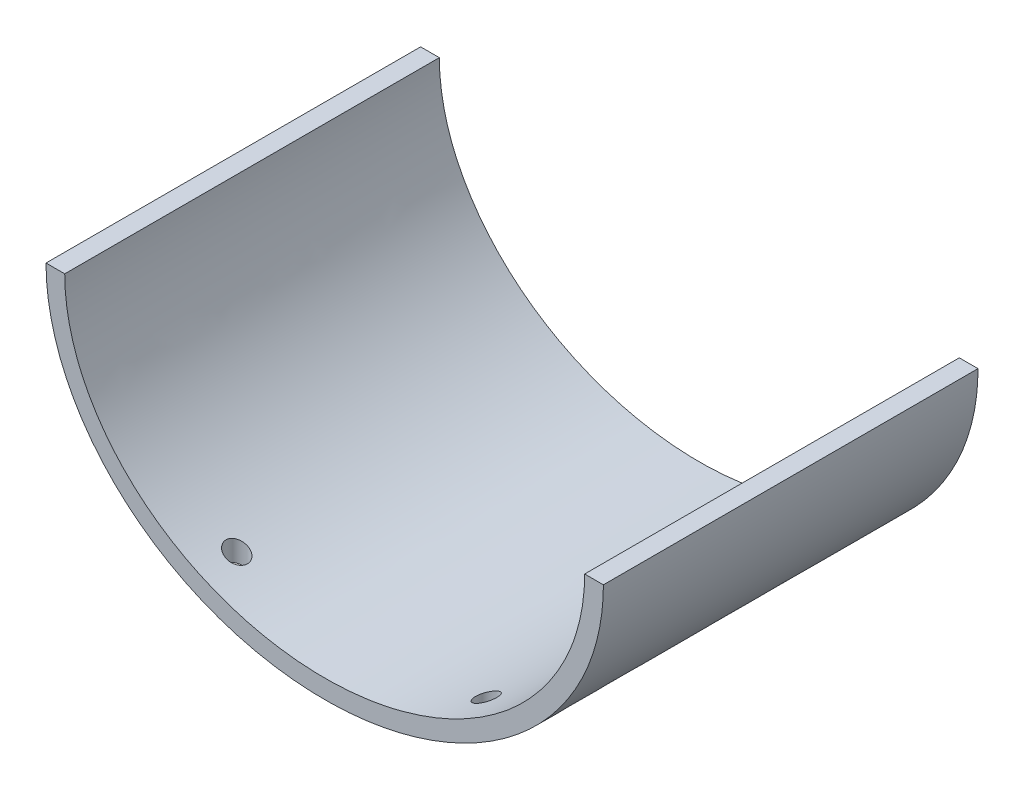
ISO-10303-21;
HEADER;
FILE_DESCRIPTION(('STEP AP214'),'2;1');
FILE_NAME('part.step','',(''),(''),'','','');
FILE_SCHEMA(('AUTOMOTIVE_DESIGN { 1 0 10303 214 1 1 1 1 }'));
ENDSEC;
DATA;
#1=APPLICATION_CONTEXT('core data for automotive mechanical design processes');
#2=APPLICATION_PROTOCOL_DEFINITION('international standard','automotive_design',2000,#1);
#3=PRODUCT_CONTEXT('',#1,'mechanical');
#4=PRODUCT('Part','Part','',(#3));
#5=PRODUCT_RELATED_PRODUCT_CATEGORY('part','',(#4));
#6=PRODUCT_DEFINITION_FORMATION('','',#4);
#7=PRODUCT_DEFINITION_CONTEXT('part definition',#1,'design');
#8=PRODUCT_DEFINITION('design','',#6,#7);
#9=PRODUCT_DEFINITION_SHAPE('','',#8);
#10=(LENGTH_UNIT() NAMED_UNIT(*) SI_UNIT(.MILLI.,.METRE.));
#11=(NAMED_UNIT(*) PLANE_ANGLE_UNIT() SI_UNIT($,.RADIAN.));
#12=(NAMED_UNIT(*) SI_UNIT($,.STERADIAN.) SOLID_ANGLE_UNIT());
#13=UNCERTAINTY_MEASURE_WITH_UNIT(LENGTH_MEASURE(1.E-05),#10,'distance_accuracy_value','');
#14=(GEOMETRIC_REPRESENTATION_CONTEXT(3) GLOBAL_UNCERTAINTY_ASSIGNED_CONTEXT((#13)) GLOBAL_UNIT_ASSIGNED_CONTEXT((#10,
#11,#12)) REPRESENTATION_CONTEXT('',''));
#15=CARTESIAN_POINT('',(0.,0.,0.));
#16=DIRECTION('',(0.,0.,1.));
#17=DIRECTION('',(1.,0.,0.));
#18=AXIS2_PLACEMENT_3D('',#15,#16,#17);
#19=CARTESIAN_POINT('',(0.152200141919166,-44.781913279814,-304.8));
#20=DIRECTION('',(0.,0.,-1.));
#21=DIRECTION('',(-1.,0.,0.));
#22=AXIS2_PLACEMENT_3D('',#19,#20,#21);
#23=PLANE('',#22);
#24=CARTESIAN_POINT('',(53.0440391266445,0.00138485695987062,-304.8));
#25=CARTESIAN_POINT('',(53.0441150079567,-5.79494898121058,-304.8));
#26=CARTESIAN_POINT('',(50.3730334268709,-17.3304753911417,-304.8));
#27=CARTESIAN_POINT('',(38.7745887881519,-32.2683006122586,-304.8));
#28=CARTESIAN_POINT('',(21.133363785884,-42.3921402956565,-304.8));
#29=CARTESIAN_POINT('',(0.152215782690763,-45.9766624367561,-304.8));
#30=CARTESIAN_POINT('',(-20.8290260651321,-42.3926896362035,-304.8));
#31=CARTESIAN_POINT('',(-38.4705161289839,-32.2693118479947,-304.8));
#32=CARTESIAN_POINT('',(-50.0693518736288,-17.3317903085017,-304.8));
#33=CARTESIAN_POINT('',(-52.7407354829451,-5.7963338381704,-304.8));
#34=CARTESIAN_POINT('',(-52.7408113642572,0.,-304.8));
#35=B_SPLINE_CURVE_WITH_KNOTS('',3,(#24,#25,#26,#27,#28,#29,#30,#31,#32,#33,#34),.UNSPECIFIED.,
.F.,.F.,(4,1,1,1,1,1,1,1,4),(3.14159265358979,3.53429173528852,3.92699081698724,
4.31968989868597,4.71238898038469,5.10508806208341,5.49778714378214,5.89048622548086,
6.28318530717959),.UNSPECIFIED.);
#36=CARTESIAN_POINT('',(53.0440391266445,0.00138485695987062,-304.8));
#37=VERTEX_POINT('',#36);
#38=CARTESIAN_POINT('',(-52.7408113642572,0.,-304.8));
#39=VERTEX_POINT('',#38);
#40=EDGE_CURVE('E113',#37,#39,#35,.T.);
#41=ORIENTED_EDGE('',*,*,#40,.F.);
#42=DIRECTION('',(-0.999999999373819,-3.53887366183351E-05,0.));
#43=VECTOR('',#42,1.);
#44=CARTESIAN_POINT('',(56.8540391079799,0.00151968804581046,-304.8));
#45=LINE('',#44,#43);
#46=CARTESIAN_POINT('',(56.8540391079799,0.00151968804581046,-304.8));
#47=VERTEX_POINT('',#46);
#48=EDGE_CURVE('E133',#47,#37,#45,.T.);
#49=ORIENTED_EDGE('',*,*,#48,.F.);
#50=CARTESIAN_POINT('',(0.151613885726054,0.,-304.8));
#51=DIRECTION('',(0.,0.,1.));
#52=DIRECTION('',(1.,0.,0.));
#53=AXIS2_PLACEMENT_3D('',#50,#51,#52);
#54=ELLIPSE('',#53,56.7024252499833,48.5926057121314);
#55=CARTESIAN_POINT('',(-56.5508113642572,0.,-304.8));
#56=VERTEX_POINT('',#55);
#57=EDGE_CURVE('E115',#56,#47,#54,.T.);
#58=ORIENTED_EDGE('',*,*,#57,.F.);
#59=DIRECTION('',(-1.,0.,0.));
#60=VECTOR('',#59,1.);
#61=CARTESIAN_POINT('',(-56.5508113642572,0.,-304.8));
#62=LINE('',#61,#60);
#63=EDGE_CURVE('E109',#39,#56,#62,.T.);
#64=ORIENTED_EDGE('',*,*,#63,.F.);
#65=EDGE_LOOP('',(#41,#49,#58,#64));
#66=FACE_BOUND('',#65,.T.);
#67=ADVANCED_FACE('F62',(#66),#23,.T.);
#68=CARTESIAN_POINT('',(0.131407706257209,-44.7826057121314,-228.6));
#69=DIRECTION('',(0.,0.,-1.));
#70=DIRECTION('',(-1.,0.,0.));
#71=AXIS2_PLACEMENT_3D('',#68,#69,#70);
#72=PLANE('',#71);
#73=CARTESIAN_POINT('',(53.0238329562405,0.,-228.6));
#74=CARTESIAN_POINT('',(53.0238329562405,-5.79633383866715,-228.6));
#75=CARTESIAN_POINT('',(50.3526003608105,-17.3318252797868,-228.6));
#76=CARTESIAN_POINT('',(38.7539601681347,-32.2694986613718,-228.6));
#77=CARTESIAN_POINT('',(21.1126026335632,-42.3931073980426,-228.6));
#78=CARTESIAN_POINT('',(0.131407706257207,-45.9773548691758,-228.6));
#79=CARTESIAN_POINT('',(-20.8497872210487,-42.3931073980426,-228.6));
#80=CARTESIAN_POINT('',(-38.4911447556203,-32.2694986613718,-228.6));
#81=CARTESIAN_POINT('',(-50.0897849482961,-17.3318252797868,-228.6));
#82=CARTESIAN_POINT('',(-52.761017543726,-5.79633383866713,-228.6));
#83=CARTESIAN_POINT('',(-52.761017543726,0.,-228.6));
#84=B_SPLINE_CURVE_WITH_KNOTS('',3,(#73,#74,#75,#76,#77,#78,#79,#80,#81,#82,#83),.UNSPECIFIED.,
.F.,.F.,(4,1,1,1,1,1,1,1,4),(3.14159265358979,3.53429173528852,3.92699081698724,
4.31968989868597,4.71238898038469,5.10508806208341,5.49778714378214,5.89048622548086,
6.28318530717959),.UNSPECIFIED.);
#85=CARTESIAN_POINT('',(53.0238329562405,0.,-228.6));
#86=VERTEX_POINT('',#85);
#87=CARTESIAN_POINT('',(-52.761017543726,0.,-228.6));
#88=VERTEX_POINT('',#87);
#89=EDGE_CURVE('E141',#86,#88,#84,.T.);
#90=ORIENTED_EDGE('',*,*,#89,.T.);
#91=DIRECTION('',(-1.,0.,0.));
#92=VECTOR('',#91,1.);
#93=CARTESIAN_POINT('',(-56.571017543726,0.,-228.6));
#94=LINE('',#93,#92);
#95=CARTESIAN_POINT('',(-56.571017543726,0.,-228.6));
#96=VERTEX_POINT('',#95);
#97=EDGE_CURVE('E12',#88,#96,#94,.T.);
#98=ORIENTED_EDGE('',*,*,#97,.T.);
#99=CARTESIAN_POINT('',(0.131407706257219,0.,-228.6));
#100=DIRECTION('',(0.,0.,1.));
#101=DIRECTION('',(1.,0.,0.));
#102=AXIS2_PLACEMENT_3D('',#99,#100,#101);
#103=ELLIPSE('',#102,56.7024252499833,48.5926057121314);
#104=CARTESIAN_POINT('',(56.8338329562405,0.,-228.6));
#105=VERTEX_POINT('',#104);
#106=EDGE_CURVE('E76',#96,#105,#103,.T.);
#107=ORIENTED_EDGE('',*,*,#106,.T.);
#108=DIRECTION('',(-1.,0.,0.));
#109=VECTOR('',#108,1.);
#110=CARTESIAN_POINT('',(53.0238329562405,0.,-228.6));
#111=LINE('',#110,#109);
#112=EDGE_CURVE('E85',#105,#86,#111,.T.);
#113=ORIENTED_EDGE('',*,*,#112,.T.);
#114=EDGE_LOOP('',(#90,#98,#107,#113));
#115=FACE_BOUND('',#114,.T.);
#116=ADVANCED_FACE('F203',(#115),#72,.F.);
#117=CARTESIAN_POINT('',(0.,-1.02365058622814E-13,0.));
#118=DIRECTION('',(0.,1.,0.));
#119=DIRECTION('',(0.,0.,1.));
#120=AXIS2_PLACEMENT_3D('',#117,#118,#119);
#121=PLANE('',#120);
#122=DIRECTION('',(0.000265172949585584,0.,-0.999999964841653));
#123=VECTOR('',#122,1.);
#124=CARTESIAN_POINT('',(-52.761017543726,0.,-228.6));
#125=LINE('',#124,#123);
#126=EDGE_CURVE('E129',#88,#39,#125,.T.);
#127=ORIENTED_EDGE('',*,*,#126,.T.);
#128=ORIENTED_EDGE('',*,*,#63,.T.);
#129=DIRECTION('',(0.000265172949585584,0.,-0.999999964841653));
#130=VECTOR('',#129,1.);
#131=CARTESIAN_POINT('',(-56.571017543726,0.,-228.6));
#132=LINE('',#131,#130);
#133=EDGE_CURVE('E103',#96,#56,#132,.T.);
#134=ORIENTED_EDGE('',*,*,#133,.F.);
#135=ORIENTED_EDGE('',*,*,#97,.F.);
#136=EDGE_LOOP('',(#127,#128,#134,#135));
#137=FACE_BOUND('',#136,.T.);
#138=ADVANCED_FACE('F138',(#137),#121,.T.);
#139=CARTESIAN_POINT('',(56.8338329562405,0.,-228.6));
#140=CARTESIAN_POINT('',(56.8540391079799,0.00151968804581609,-304.8));
#141=CARTESIAN_POINT('',(56.8338329562405,-24.2963028560657,-228.6));
#142=CARTESIAN_POINT('',(56.8550779047507,-28.4637226161935,-304.8));
#143=CARTESIAN_POINT('',(37.9330245395794,-48.5926057121314,-228.6));
#144=CARTESIAN_POINT('',(33.3684240549887,-48.5921605943485,-304.8));
#145=CARTESIAN_POINT('',(-37.670209127065,-48.5926057121314,-228.6));
#146=CARTESIAN_POINT('',(-33.0634229685113,-48.5930508180326,-304.8));
#147=CARTESIAN_POINT('',(-56.571017543726,-24.2963028560657,-228.6));
#148=CARTESIAN_POINT('',(-56.5508113642572,-28.4652423181597,-304.8));
#149=CARTESIAN_POINT('',(-56.571017543726,0.,-228.6));
#150=CARTESIAN_POINT('',(-56.5508113642572,0.,-304.8));
#151=(BOUNDED_SURFACE() B_SPLINE_SURFACE(3,1,((#139,#140),(#141,#142),(#143,#144),(#145,#146),
(#147,#148),(#149,#150)),.UNSPECIFIED.,.F.,.F.,.F.) B_SPLINE_SURFACE_WITH_KNOTS((4,2,4),(2,2),
(0.,0.5,1.),(0.,1.),
.UNSPECIFIED.) GEOMETRIC_REPRESENTATION_ITEM() RATIONAL_B_SPLINE_SURFACE(((1.,1.),
(0.666666666666667,0.647597081833396),(0.5,0.521143499124749),(0.5,0.521143499124749),
(0.666666666666667,0.647597081833396),(1.,1.))) REPRESENTATION_ITEM('') SURFACE());
#152=CARTESIAN_POINT('',(-25.4167372655,-43.3767009237951,-234.075777413346));
#153=CARTESIAN_POINT('',(-25.5494443396394,-43.3192696618781,-234.075781362807));
#154=CARTESIAN_POINT('',(-25.6820512942949,-43.2613077434191,-234.087895189159));
#155=CARTESIAN_POINT('',(-25.9433208390566,-43.1459963113419,-234.136029522911));
#156=CARTESIAN_POINT('',(-26.0719769154202,-43.0886479010181,-234.172087502343));
#157=CARTESIAN_POINT('',(-26.3216543889464,-42.9763394274166,-234.267541374111));
#158=CARTESIAN_POINT('',(-26.4426685791868,-42.9213816334433,-234.326958925913));
#159=CARTESIAN_POINT('',(-26.673052758139,-42.8158894110511,-234.468108936634));
#160=CARTESIAN_POINT('',(-26.7824278792819,-42.7653530347013,-234.549831502656));
#161=CARTESIAN_POINT('',(-26.9815489564699,-42.6726928588714,-234.730369223526));
#162=CARTESIAN_POINT('',(-27.0718965971604,-42.6303168252148,-234.828388150693));
#163=CARTESIAN_POINT('',(-27.2343754260759,-42.5536787798235,-235.04128920421));
#164=CARTESIAN_POINT('',(-27.3065181842353,-42.519411615443,-235.156160546382));
#165=CARTESIAN_POINT('',(-27.4232693757507,-42.4637166155731,-235.388006755328));
#166=CARTESIAN_POINT('',(-27.4698170914435,-42.4413899299275,-235.503788219892));
#167=CARTESIAN_POINT('',(-27.542679177612,-42.4063311543821,-235.742914065447));
#168=CARTESIAN_POINT('',(-27.5690079447743,-42.3935922377426,-235.866252997528));
#169=CARTESIAN_POINT('',(-27.5986234527014,-42.3791828186257,-236.104898442303));
#170=CARTESIAN_POINT('',(-27.6037789673319,-42.3766153864511,-236.219922408151));
#171=CARTESIAN_POINT('',(-27.5959618884805,-42.3802033871989,-236.449200107735));
#172=CARTESIAN_POINT('',(-27.5829935679837,-42.3863567640554,-236.563454016645));
#173=CARTESIAN_POINT('',(-27.5402601101665,-42.4067053394966,-236.784077749089));
#174=CARTESIAN_POINT('',(-27.5110595365225,-42.4206303012164,-236.890583244524));
#175=CARTESIAN_POINT('',(-27.4374863793507,-42.4556497367419,-237.096946056691));
#176=CARTESIAN_POINT('',(-27.3931120388099,-42.4767450408198,-237.196802601923));
#177=CARTESIAN_POINT('',(-27.2888691641157,-42.526125143,-237.391262738166));
#178=CARTESIAN_POINT('',(-27.2284757070842,-42.5546527816735,-237.485522290872));
#179=CARTESIAN_POINT('',(-27.0951689244148,-42.6173152749682,-237.662593202275));
#180=CARTESIAN_POINT('',(-27.0222515727495,-42.6514519325543,-237.745400864059));
#181=CARTESIAN_POINT('',(-26.8593715709027,-42.7272657966564,-237.904696135072));
#182=CARTESIAN_POINT('',(-26.7684901326202,-42.7693361006193,-237.980062253532));
#183=CARTESIAN_POINT('',(-26.6250591012497,-42.8352651848173,-238.080888729516));
#184=CARTESIAN_POINT('',(-26.5760451031166,-42.8577207055514,-238.112469562846));
#185=CARTESIAN_POINT('',(-26.4758917348292,-42.9034408482614,-238.171505652898));
#186=CARTESIAN_POINT('',(-26.4247507077493,-42.9267060986128,-238.198957613432));
#187=CARTESIAN_POINT('',(-26.2591985484904,-43.0017359158097,-238.279529934908));
#188=CARTESIAN_POINT('',(-26.1413645493347,-43.0547226834243,-238.324696444902));
#189=CARTESIAN_POINT('',(-25.9003012618145,-43.1621643514315,-238.394073234629));
#190=CARTESIAN_POINT('',(-25.7770700026157,-43.216619785278,-238.418275791112));
#191=CARTESIAN_POINT('',(-25.5868511031778,-43.2999172021358,-238.438953585027));
#192=CARTESIAN_POINT('',(-25.5206300839416,-43.328777169142,-238.443112587863));
#193=CARTESIAN_POINT('',(-25.3880665031757,-43.3862731332319,-238.445394603577));
#194=CARTESIAN_POINT('',(-25.3217241169125,-43.414909317066,-238.443523347789));
#195=CARTESIAN_POINT('',(-25.1230472120899,-43.5002521439643,-238.42880870048));
#196=CARTESIAN_POINT('',(-24.991026684462,-43.556408940608,-238.406868362684));
#197=CARTESIAN_POINT('',(-24.7316920467767,-43.6656908794645,-238.338724353101));
#198=CARTESIAN_POINT('',(-24.6043914162878,-43.7188075438949,-238.292456178364));
#199=CARTESIAN_POINT('',(-24.3589986130794,-43.8203041628414,-238.176214417021));
#200=CARTESIAN_POINT('',(-24.240904169279,-43.868685286329,-238.106246699783));
#201=CARTESIAN_POINT('',(-24.0240465083968,-43.9568391430623,-237.948106823018));
#202=CARTESIAN_POINT('',(-23.9246062743964,-43.9969242023035,-237.861039147667));
#203=CARTESIAN_POINT('',(-23.7419467764584,-44.0701032712174,-237.668804307523));
#204=CARTESIAN_POINT('',(-23.6587193012977,-44.1032008205466,-237.56364635594));
#205=CARTESIAN_POINT('',(-23.5177418583786,-44.1590105110625,-237.346848497035));
#206=CARTESIAN_POINT('',(-23.4585361304265,-44.1823208517764,-237.236308946188));
#207=CARTESIAN_POINT('',(-23.3596190330786,-44.221171893109,-237.005563767712));
#208=CARTESIAN_POINT('',(-23.3198987290383,-44.2367161547657,-236.885362599702));
#209=CARTESIAN_POINT('',(-23.2636686474477,-44.2587278900461,-236.647301818558));
#210=CARTESIAN_POINT('',(-23.2458009170719,-44.2657263610639,-236.529810566743));
#211=CARTESIAN_POINT('',(-23.2293759975986,-44.2722340540305,-236.293290575568));
#212=CARTESIAN_POINT('',(-23.2308142805113,-44.2717450320757,-236.174262203263));
#213=CARTESIAN_POINT('',(-23.2525833833432,-44.2634313328131,-235.942040009181));
#214=CARTESIAN_POINT('',(-23.2723137245413,-44.2558397415135,-235.828780855203));
#215=CARTESIAN_POINT('',(-23.3290292016325,-44.233894716211,-235.607380483478));
#216=CARTESIAN_POINT('',(-23.3660143268729,-44.2195412863827,-235.499239262571));
#217=CARTESIAN_POINT('',(-23.4563395416237,-44.1843111715169,-235.289837001598));
#218=CARTESIAN_POINT('',(-23.509836201732,-44.1633719993812,-235.188653683375));
#219=CARTESIAN_POINT('',(-23.6007337109705,-44.1275901563391,-235.044873421781));
#220=CARTESIAN_POINT('',(-23.6328183989825,-44.114930020234,-234.998267622085));
#221=CARTESIAN_POINT('',(-23.7003124445783,-44.0882211389464,-234.907893732439));
#222=CARTESIAN_POINT('',(-23.7357242278262,-44.0741713802411,-234.864127752821));
#223=CARTESIAN_POINT('',(-23.8498463868078,-44.0287530239327,-234.733685448355));
#224=CARTESIAN_POINT('',(-23.9337117967333,-43.9951867254276,-234.652185162058));
#225=CARTESIAN_POINT('',(-24.1120866607227,-43.9232584640355,-234.504351065972));
#226=CARTESIAN_POINT('',(-24.2066014543406,-43.8848940943471,-234.438024915386));
#227=CARTESIAN_POINT('',(-24.357698817412,-43.8230722527372,-234.348688476122));
#228=CARTESIAN_POINT('',(-24.4114874621303,-43.8009767245805,-234.319876194177));
#229=CARTESIAN_POINT('',(-24.5208938662264,-43.7558422688073,-234.266999501505));
#230=CARTESIAN_POINT('',(-24.5765099493042,-43.73280420127,-234.24293087389));
#231=CARTESIAN_POINT('',(-24.7455603458834,-43.6624694803901,-234.17795083292));
#232=CARTESIAN_POINT('',(-24.8613240033612,-43.6139003556514,-234.144190690202));
#233=CARTESIAN_POINT('',(-25.0508427072453,-43.5336640146249,-234.105370319251));
#234=CARTESIAN_POINT('',(-25.1237205062727,-43.5026415241404,-234.094271164493));
#235=CARTESIAN_POINT('',(-25.2699881509037,-43.4400337224668,-234.079473555899));
#236=CARTESIAN_POINT('',(-25.3433780053455,-43.4084484015486,-234.075775230121));
#237=CARTESIAN_POINT('',(-25.4167372655,-43.3767009237951,-234.075777413346));
#238=B_SPLINE_CURVE_WITH_KNOTS('',3,(#152,#153,#154,#155,#156,#157,#158,#159,#160,#161,#162,
#163,#164,#165,#166,#167,#168,#169,#170,#171,#172,#173,#174,#175,#176,#177,#178,#179,#180,#181,
#182,#183,#184,#185,#186,#187,#188,#189,#190,#191,#192,#193,#194,#195,#196,#197,#198,#199,#200,
#201,#202,#203,#204,#205,#206,#207,#208,#209,#210,#211,#212,#213,#214,#215,#216,#217,#218,#219,
#220,#221,#222,#223,#224,#225,#226,#227,#228,#229,#230,#231,#232,#233,#234,#235,#236,#237),
.UNSPECIFIED.,.T.,.F.,(4,2,2,2,2,2,2,2,2,2,2,2,2,2,2,2,2,2,2,2,2,2,2,2,2,2,2,2,2,2,2,2,2,2,2,2,
2,2,2,2,2,2,4),(0.,0.433512003423858,0.867704046803626,1.3022996348928,1.73670278005938,
2.15406586131098,2.57116301969293,2.94939464023502,3.32735669462933,3.67113159417474,
4.01482545693739,4.34725246632788,4.67971798141629,5.02482322235029,5.3700396118263,
5.74436180265177,5.93165719719411,6.11910132991839,6.52781793466884,6.93668504917037,
7.15352649018211,7.37016189953958,7.80331486250291,8.23762212414325,8.6718219049129,
9.08397914104745,9.49592708741709,9.87656083819139,10.2570198935919,10.6123881359444,
10.9676730324703,11.3116927779861,11.6557123111125,12.0030998021482,12.1768873803105,
12.3508026586649,12.7141196724156,13.0776196692219,13.2721216518325,13.4664499434881,
13.854642612319,14.0942799472949,14.3339214286968),.UNSPECIFIED.);
#239=CARTESIAN_POINT('',(-25.4167372655,-43.3767009237951,-234.075777413346));
#240=VERTEX_POINT('',#239);
#241=EDGE_CURVE('E193',#240,#240,#238,.T.);
#242=CARTESIAN_POINT('',(25.3832468464606,-43.5052622235901,-234.0356));
#243=CARTESIAN_POINT('',(25.2535216176295,-43.5605803652568,-234.035603767682));
#244=CARTESIAN_POINT('',(25.123509302572,-43.6154801315287,-234.047178062471));
#245=CARTESIAN_POINT('',(24.8665448863634,-43.7229495939882,-234.093571399911));
#246=CARTESIAN_POINT('',(24.7395965911405,-43.7755164541366,-234.128417950711));
#247=CARTESIAN_POINT('',(24.4924364584053,-43.8769257569984,-234.221124373353));
#248=CARTESIAN_POINT('',(24.3722376851171,-43.9257610386578,-234.279027231619));
#249=CARTESIAN_POINT('',(24.1429711992796,-44.0181248425526,-234.416893420246));
#250=CARTESIAN_POINT('',(24.0338981230234,-44.0616559239353,-234.496846050878));
#251=CARTESIAN_POINT('',(23.8361574735335,-44.1399941617188,-234.672510927517));
#252=CARTESIAN_POINT('',(23.7467408989638,-44.1751293351394,-234.76723177981));
#253=CARTESIAN_POINT('',(23.5853059002884,-44.2381967570705,-234.97258526437));
#254=CARTESIAN_POINT('',(23.5132796816218,-44.2661322329497,-235.083210732395));
#255=CARTESIAN_POINT('',(23.3944034793737,-44.3120377561795,-235.30835356638));
#256=CARTESIAN_POINT('',(23.3460847596302,-44.3305923148968,-235.421976992787));
#257=CARTESIAN_POINT('',(23.2691387627284,-44.360054416908,-235.656637894669));
#258=CARTESIAN_POINT('',(23.2405036619911,-44.37096499846,-235.77767240363));
#259=CARTESIAN_POINT('',(23.2052133632068,-44.3843708990562,-236.016300620274));
#260=CARTESIAN_POINT('',(23.1974035080541,-44.3873084616359,-236.133700058697));
#261=CARTESIAN_POINT('',(23.2007284162694,-44.3859546696654,-236.368178054038));
#262=CARTESIAN_POINT('',(23.2118600100953,-44.3816645245554,-236.485256661359));
#263=CARTESIAN_POINT('',(23.2521937753888,-44.3661535762595,-236.713314122733));
#264=CARTESIAN_POINT('',(23.2810267355302,-44.3550743861806,-236.82436839264));
#265=CARTESIAN_POINT('',(23.3553360558234,-44.3264433550284,-237.039861987659));
#266=CARTESIAN_POINT('',(23.40081317199,-44.3088912199391,-237.14430101204));
#267=CARTESIAN_POINT('',(23.5078279253476,-44.267407326375,-237.345916476861));
#268=CARTESIAN_POINT('',(23.5696634125708,-44.243357057117,-237.442910024174));
#269=CARTESIAN_POINT('',(23.7068313232356,-44.1897039163535,-237.625077936744));
#270=CARTESIAN_POINT('',(23.782166431167,-44.1600999404014,-237.710249945219));
#271=CARTESIAN_POINT('',(23.9482099042063,-44.0944204604132,-237.871157192485));
#272=CARTESIAN_POINT('',(24.0395133226373,-44.0580887785363,-237.946172989412));
#273=CARTESIAN_POINT('',(24.231686247576,-43.9810303802665,-238.079900167701));
#274=CARTESIAN_POINT('',(24.332558556664,-43.9403023757739,-238.138606752445));
#275=CARTESIAN_POINT('',(24.5483626392914,-43.8524558631661,-238.242344070542));
#276=CARTESIAN_POINT('',(24.6637842908085,-43.8050901303414,-238.286146335687));
#277=CARTESIAN_POINT('',(24.8992437850442,-43.7075871932492,-238.353625557736));
#278=CARTESIAN_POINT('',(25.0192831157576,-43.6574490933023,-238.377295969626));
#279=CARTESIAN_POINT('',(25.2688105266972,-43.5522738988621,-238.405238810288));
#280=CARTESIAN_POINT('',(25.3984066270975,-43.4971299360975,-238.408154089137));
#281=CARTESIAN_POINT('',(25.6559626882788,-43.3864927053896,-238.39115102418));
#282=CARTESIAN_POINT('',(25.7839221945814,-43.3309993465413,-238.37122647128));
#283=CARTESIAN_POINT('',(26.03899951337,-43.2193720183503,-238.307923376666));
#284=CARTESIAN_POINT('',(26.1659483083841,-43.1632779578941,-238.263788050341));
#285=CARTESIAN_POINT('',(26.4107312863476,-43.0541826784113,-238.152345805645));
#286=CARTESIAN_POINT('',(26.5285651659997,-43.0011815623164,-238.085038116625));
#287=CARTESIAN_POINT('',(26.7486559497079,-42.9014334304143,-237.930247995932));
#288=CARTESIAN_POINT('',(26.8512052738496,-42.8545719300486,-237.843257172805));
#289=CARTESIAN_POINT('',(27.0399312108701,-42.7677997628416,-237.650105054502));
#290=CARTESIAN_POINT('',(27.126116306569,-42.7278854956216,-237.543953747634));
#291=CARTESIAN_POINT('',(27.2721532518249,-42.6599446180354,-237.324365597869));
#292=CARTESIAN_POINT('',(27.333550901532,-42.6312265153657,-237.212173168553));
#293=CARTESIAN_POINT('',(27.4362453477453,-42.5830705945255,-236.977107293323));
#294=CARTESIAN_POINT('',(27.4775576034204,-42.5636256392925,-236.854242148031));
#295=CARTESIAN_POINT('',(27.5349981182208,-42.5365848625194,-236.614116826158));
#296=CARTESIAN_POINT('',(27.5531610471757,-42.5280317920437,-236.497448544476));
#297=CARTESIAN_POINT('',(27.5704073955292,-42.5199710311215,-236.262415608027));
#298=CARTESIAN_POINT('',(27.5694980157218,-42.5204599268515,-236.144051610348));
#299=CARTESIAN_POINT('',(27.5492271888817,-42.5301764533495,-235.915772605563));
#300=CARTESIAN_POINT('',(27.5308649285134,-42.538930708378,-235.805746531194));
#301=CARTESIAN_POINT('',(27.4779394493673,-42.5640504218791,-235.590599554583));
#302=CARTESIAN_POINT('',(27.4433758404558,-42.5804160636361,-235.485478770527));
#303=CARTESIAN_POINT('',(27.3587182999621,-42.6203316824023,-235.281098006521));
#304=CARTESIAN_POINT('',(27.308385199655,-42.6439922029934,-235.181958411095));
#305=CARTESIAN_POINT('',(27.2228366974846,-42.6840081611031,-235.040782779678));
#306=CARTESIAN_POINT('',(27.1926349394556,-42.6981060175839,-234.994966996172));
#307=CARTESIAN_POINT('',(27.1290909940922,-42.7276930343649,-234.905990437222));
#308=CARTESIAN_POINT('',(27.0957466575691,-42.7431831464791,-234.862831512626));
#309=CARTESIAN_POINT('',(26.9864709929518,-42.7938092716568,-234.731784003015));
#310=CARTESIAN_POINT('',(26.9053365664736,-42.831205144767,-234.649011838325));
#311=CARTESIAN_POINT('',(26.7322978409174,-42.9104169097236,-234.498122470881));
#312=CARTESIAN_POINT('',(26.6403870234123,-42.9522354752556,-234.430014209407));
#313=CARTESIAN_POINT('',(26.4918690212602,-43.0193106812245,-234.336810227723));
#314=CARTESIAN_POINT('',(26.4381492754696,-43.0434798548315,-234.306213686613));
#315=CARTESIAN_POINT('',(26.3286452187081,-43.0925449702753,-234.249817963474));
#316=CARTESIAN_POINT('',(26.2728627973379,-43.1174402427277,-234.224014514986));
#317=CARTESIAN_POINT('',(26.1029217938465,-43.1929597198811,-234.153927152879));
#318=CARTESIAN_POINT('',(25.9860525286579,-43.2444704892693,-234.116893345532));
#319=CARTESIAN_POINT('',(25.7878083710944,-43.3310653731133,-234.071842754171));
#320=CARTESIAN_POINT('',(25.7075274449038,-43.3659269759662,-234.058274722136));
#321=CARTESIAN_POINT('',(25.5459510180589,-43.4356680472728,-234.040151914034));
#322=CARTESIAN_POINT('',(25.4646554616374,-43.4705475166066,-234.035597635604));
#323=CARTESIAN_POINT('',(25.3832468464606,-43.5052622235901,-234.0356));
#324=B_SPLINE_CURVE_WITH_KNOTS('',3,(#242,#243,#244,#245,#246,#247,#248,#249,#250,#251,#252,
#253,#254,#255,#256,#257,#258,#259,#260,#261,#262,#263,#264,#265,#266,#267,#268,#269,#270,#271,
#272,#273,#274,#275,#276,#277,#278,#279,#280,#281,#282,#283,#284,#285,#286,#287,#288,#289,#290,
#291,#292,#293,#294,#295,#296,#297,#298,#299,#300,#301,#302,#303,#304,#305,#306,#307,#308,#309,
#310,#311,#312,#313,#314,#315,#316,#317,#318,#319,#320,#321,#322,#323),.UNSPECIFIED.,.T.,.F.,(4,
2,2,2,2,2,2,2,2,2,2,2,2,2,2,2,2,2,2,2,2,2,2,2,2,2,2,2,2,2,2,2,2,2,2,2,2,2,2,2,4),(0.,
0.422769351399686,0.846039308935911,1.27010213841887,1.69395955090883,2.09656111417813,
2.49898189033299,2.87162047013001,3.2441108528038,3.59547197657744,3.94677431158535,
4.29098710135311,4.63521552797466,4.98620371511667,5.33726177621348,5.70654461629839,
6.07593594953795,6.4709056744539,6.86600375792812,7.28671769646998,7.70754603477793,
8.14234727767517,8.57716298229857,9.00212785952966,9.42687184020554,9.81794878427398,
10.2087242489071,10.5620364461295,10.915215251921,11.2493200550184,11.5834329038795,
11.9228807152157,12.0927085963064,12.2626534762265,12.6263953292898,12.9903583488856,
13.1893016274265,13.3880669636929,13.7851596069777,14.0504523937507,14.3157598265974),.UNSPECIFIED.);
#325=CARTESIAN_POINT('',(25.3832468464606,-43.5052622235901,-234.0356));
#326=VERTEX_POINT('',#325);
#327=EDGE_CURVE('E134',#326,#326,#324,.T.);
#328=DIRECTION('',(0.000265172585630246,1.99434119695358E-05,-0.999999964642879));
#329=VECTOR('',#328,1.);
#330=CARTESIAN_POINT('',(56.8439360321102,0.000759844022905254,-266.7));
#331=LINE('',#330,#329);
#332=EDGE_CURVE('E120',#105,#47,#331,.T.);
#333=ORIENTED_EDGE('',*,*,#241,.F.);
#334=EDGE_LOOP('',(#333));
#335=FACE_BOUND('',#334,.T.);
#336=ORIENTED_EDGE('',*,*,#327,.F.);
#337=EDGE_LOOP('',(#336));
#338=FACE_BOUND('',#337,.T.);
#339=ORIENTED_EDGE('',*,*,#106,.F.);
#340=ORIENTED_EDGE('',*,*,#133,.T.);
#341=ORIENTED_EDGE('',*,*,#57,.T.);
#342=ORIENTED_EDGE('',*,*,#332,.F.);
#343=EDGE_LOOP('',(#339,#340,#341,#342));
#344=FACE_BOUND('',#343,.T.);
#345=ADVANCED_FACE('F168',(#335,#338,#344),#151,.T.);
#346=CARTESIAN_POINT('',(-52.761017543726,0.,-228.6));
#347=CARTESIAN_POINT('',(-52.7408113642572,0.,-304.8));
#348=CARTESIAN_POINT('',(-52.761017543726,-4.74727944667887,-228.6));
#349=CARTESIAN_POINT('',(-52.7407492163887,-4.74727944627204,-304.8));
#350=CARTESIAN_POINT('',(-51.4027703927197,-11.8061889317137,-228.6));
#351=CARTESIAN_POINT('',(-51.3824096554809,-11.8061711495358,-304.8));
#352=CARTESIAN_POINT('',(-45.5956975606814,-23.6133867660202,-228.6));
#353=CARTESIAN_POINT('',(-45.5751822528459,-23.6132929609314,-304.800000000001));
#354=CARTESIAN_POINT('',(-39.7951691207351,-29.862955227856,-228.6));
#355=CARTESIAN_POINT('',(-39.7745719986723,-29.8627854860066,-304.799999999999));
#356=CARTESIAN_POINT('',(-30.7185837666129,-36.6746342618288,-228.599999999999));
#357=CARTESIAN_POINT('',(-30.697897471868,-36.6743456954595,-304.800000000001));
#358=CARTESIAN_POINT('',(-20.2721559148378,-42.2612469589402,-228.600000000001));
#359=CARTESIAN_POINT('',(-20.2513964851899,-42.2608216351908,-304.799999999999));
#360=CARTESIAN_POINT('',(-8.60958328232494,-44.4955861753712,-228.599999999999));
#361=CARTESIAN_POINT('',(-8.58879460336135,-44.4950081736618,-304.800000000001));
#362=CARTESIAN_POINT('',(5.25896314379183,-45.021190556499,-228.600000000001));
#363=CARTESIAN_POINT('',(5.27975870239051,-45.0204309980013,-304.8));
#364=CARTESIAN_POINT('',(17.6594862503019,-43.279675378611,-228.600000000002));
#365=CARTESIAN_POINT('',(17.6802590092101,-43.2787534817922,-304.800000000001));
#366=CARTESIAN_POINT('',(30.4647029086039,-37.0589280577975,-228.599999999999));
#367=CARTESIAN_POINT('',(30.4853942289959,-37.0578385250945,-304.8));
#368=CARTESIAN_POINT('',(38.5357121810904,-31.06025081247,-228.599999999999));
#369=CARTESIAN_POINT('',(38.5563249705487,-31.0590556206018,-304.8));
#370=CARTESIAN_POINT('',(44.8629692880368,-24.5834918017367,-228.6));
#371=CARTESIAN_POINT('',(44.8834972880177,-24.5822137786565,-304.799999999999));
#372=CARTESIAN_POINT('',(51.1907833433093,-13.9412237721091,-228.599999999999));
#373=CARTESIAN_POINT('',(51.211172022053,-13.9398629108833,-304.800000000001));
#374=CARTESIAN_POINT('',(53.0238329562405,-5.07729150289877,-228.6));
#375=CARTESIAN_POINT('',(53.0441055947866,-5.07590664550379,-304.8));
#376=CARTESIAN_POINT('',(53.0238329562405,0.,-228.6));
#377=CARTESIAN_POINT('',(53.0440391266445,0.00138485695987062,-304.8));
#378=B_SPLINE_SURFACE_WITH_KNOTS('',3,1,((#346,#347),(#348,#349),(#350,#351),(#352,#353),(#354,
#355),(#356,#357),(#358,#359),(#360,#361),(#362,#363),(#364,#365),(#366,#367),(#368,#369),(#370,
#371),(#372,#373),(#374,#375),(#376,#377)),.UNSPECIFIED.,.F.,.F.,.F.,(4,1,1,2,1,2,1,1,1,1,1,4),
(2,2),(0.,0.0926703271745861,0.138032036943159,0.255929417067768,0.359592664000594,
0.484831486312324,0.630530283942984,0.725178151200357,0.760432960628783,0.826579850027674,
0.900919868881008,1.),(0.,1.),.UNSPECIFIED.);
#379=CARTESIAN_POINT('',(-25.4167372655,-39.2030156296255,-234.075777413346));
#380=CARTESIAN_POINT('',(-25.2855502347571,-39.2644554029795,-234.075780966313));
#381=CARTESIAN_POINT('',(-25.1540284840653,-39.3254296242763,-234.087614925087));
#382=CARTESIAN_POINT('',(-24.8939763163749,-39.4447967674923,-234.135130008583));
#383=CARTESIAN_POINT('',(-24.7654497592967,-39.5031864373271,-234.170840315184));
#384=CARTESIAN_POINT('',(-24.5151024683539,-39.6158440739743,-234.266029993159));
#385=CARTESIAN_POINT('',(-24.3932983192184,-39.6701019624165,-234.325565399866));
#386=CARTESIAN_POINT('',(-24.1610766017012,-39.7726465169691,-234.4675762013));
#387=CARTESIAN_POINT('',(-24.0506527407748,-39.8209364859172,-234.550038824504));
#388=CARTESIAN_POINT('',(-23.8519796543788,-39.9071655815654,-234.730462733421));
#389=CARTESIAN_POINT('',(-23.7627864225097,-39.9455575714419,-234.827165149215));
#390=CARTESIAN_POINT('',(-23.60220450346,-40.014280021534,-235.036869863318));
#391=CARTESIAN_POINT('',(-23.5308055974832,-40.0446151092695,-235.149862747328));
#392=CARTESIAN_POINT('',(-23.4146063466878,-40.0937795371479,-235.378126774502));
#393=CARTESIAN_POINT('',(-23.3680173521207,-40.1133868590681,-235.492321008045));
#394=CARTESIAN_POINT('',(-23.2945810033919,-40.1442196242796,-235.727954825453));
#395=CARTESIAN_POINT('',(-23.2677242788398,-40.1554490460776,-235.849390940657));
#396=CARTESIAN_POINT('',(-23.2360999826551,-40.1686539705038,-236.087347421465));
#397=CARTESIAN_POINT('',(-23.2299849774049,-40.1711940562064,-236.203659315713));
#398=CARTESIAN_POINT('',(-23.2363100114683,-40.168522350175,-236.435675717576));
#399=CARTESIAN_POINT('',(-23.2487466010212,-40.1633119996735,-236.551380334103));
#400=CARTESIAN_POINT('',(-23.2911600144988,-40.1455189684159,-236.776250317228));
#401=CARTESIAN_POINT('',(-23.3207429233012,-40.1331018457509,-236.885503705838));
#402=CARTESIAN_POINT('',(-23.395965634246,-40.1014190612966,-237.09726397646));
#403=CARTESIAN_POINT('',(-23.4416064318011,-40.0821529749461,-237.199770439768));
#404=CARTESIAN_POINT('',(-23.5485825629826,-40.0367820156119,-237.397981163041));
#405=CARTESIAN_POINT('',(-23.6102785580647,-40.0105196057011,-237.493454118137));
#406=CARTESIAN_POINT('',(-23.7466169508295,-39.95213951275,-237.672616442994));
#407=CARTESIAN_POINT('',(-23.8212623578829,-39.9200204685719,-237.756303065469));
#408=CARTESIAN_POINT('',(-23.9861353710427,-39.8485966178306,-237.915134071918));
#409=CARTESIAN_POINT('',(-24.0770419536041,-39.8089698522257,-237.989427692585));
#410=CARTESIAN_POINT('',(-24.2680355543098,-39.7250543655757,-238.121789663185));
#411=CARTESIAN_POINT('',(-24.368125639706,-39.680764086202,-238.17985256573));
#412=CARTESIAN_POINT('',(-24.5832348457578,-39.5847777618103,-238.283109045996));
#413=CARTESIAN_POINT('',(-24.6988055326129,-39.5327722931341,-238.326862921749));
#414=CARTESIAN_POINT('',(-24.9344140167526,-39.4257523768708,-238.394182492995));
#415=CARTESIAN_POINT('',(-25.0544534550676,-39.3707368203548,-238.417740694313));
#416=CARTESIAN_POINT('',(-25.2401386444333,-39.2848321858952,-238.438411645305));
#417=CARTESIAN_POINT('',(-25.3053365805667,-39.2545186238287,-238.442710175277));
#418=CARTESIAN_POINT('',(-25.4357154848901,-39.1935960365271,-238.445466938284));
#419=CARTESIAN_POINT('',(-25.5008964535744,-39.1629870798733,-238.443926495887));
#420=CARTESIAN_POINT('',(-25.6308069484634,-39.1016783379702,-238.435037395712));
#421=CARTESIAN_POINT('',(-25.6955365378857,-39.0709785663339,-238.42768956846));
#422=CARTESIAN_POINT('',(-25.8241923491431,-39.0096630177998,-238.407229942167));
#423=CARTESIAN_POINT('',(-25.8881175657536,-38.9790473774063,-238.39411154995));
#424=CARTESIAN_POINT('',(-26.0829122571093,-38.8853070678765,-238.344929072408));
#425=CARTESIAN_POINT('',(-26.2117530199409,-38.8226722029,-238.29936730081));
#426=CARTESIAN_POINT('',(-26.4600017425943,-38.7008807226335,-238.184210866074));
#427=CARTESIAN_POINT('',(-26.5794137675546,-38.6417226112082,-238.114626630351));
#428=CARTESIAN_POINT('',(-26.7468166088584,-38.558122149794,-237.994266957078));
#429=CARTESIAN_POINT('',(-26.8000384951696,-38.5314302799808,-237.952136969389));
#430=CARTESIAN_POINT('',(-26.9027431121665,-38.4797309272956,-237.862681448429));
#431=CARTESIAN_POINT('',(-26.9522292037986,-38.4547219326627,-237.815360681448));
#432=CARTESIAN_POINT('',(-27.0469695262849,-38.4066806277118,-237.715742181173));
#433=CARTESIAN_POINT('',(-27.0922242905178,-38.3836480682851,-237.66344507685));
#434=CARTESIAN_POINT('',(-27.1779673229353,-38.3398775641463,-237.554202677327));
#435=CARTESIAN_POINT('',(-27.2184551378427,-38.3191398376555,-237.497256940971));
#436=CARTESIAN_POINT('',(-27.3247095247553,-38.2645751935732,-237.33129802839));
#437=CARTESIAN_POINT('',(-27.3845085793463,-38.233690633601,-237.217352108452));
#438=CARTESIAN_POINT('',(-27.4835868061216,-38.1823735905205,-236.978785528711));
#439=CARTESIAN_POINT('',(-27.5228860255469,-38.1619308964895,-236.854175437015));
#440=CARTESIAN_POINT('',(-27.5755249998043,-38.1345246894946,-236.613254574426));
#441=CARTESIAN_POINT('',(-27.5913182622605,-38.1262877013691,-236.497622879141));
#442=CARTESIAN_POINT('',(-27.6042303607687,-38.1195751196468,-236.265060375708));
#443=CARTESIAN_POINT('',(-27.6013570000095,-38.1210954472063,-236.148130130796));
#444=CARTESIAN_POINT('',(-27.5778549970294,-38.133402926555,-235.923862748035));
#445=CARTESIAN_POINT('',(-27.5583230438391,-38.1436176178606,-235.816376285976));
#446=CARTESIAN_POINT('',(-27.5038602017017,-38.1720120473895,-235.606510523734));
#447=CARTESIAN_POINT('',(-27.4689285985619,-38.1901921550263,-235.504131460663));
#448=CARTESIAN_POINT('',(-27.384105474214,-38.2341686078946,-235.304627547478));
#449=CARTESIAN_POINT('',(-27.3338899046118,-38.2601297218442,-235.20767654728));
#450=CARTESIAN_POINT('',(-27.2490585970693,-38.3037761765073,-235.069745618379));
#451=CARTESIAN_POINT('',(-27.2191856177461,-38.3191148566232,-235.025004627519));
#452=CARTESIAN_POINT('',(-27.1564794824921,-38.3512323840958,-234.938144808349));
#453=CARTESIAN_POINT('',(-27.1236444211195,-38.3680121581387,-234.896027697796));
#454=CARTESIAN_POINT('',(-27.0152212778201,-38.4232708044952,-234.766939811708));
#455=CARTESIAN_POINT('',(-26.9345702114886,-38.4641625659164,-234.685160327958));
#456=CARTESIAN_POINT('',(-26.7629486387464,-38.5505797648462,-234.536154698714));
#457=CARTESIAN_POINT('',(-26.6719709982106,-38.5961084034882,-234.468938708831));
#458=CARTESIAN_POINT('',(-26.5243888622106,-38.6694133743551,-234.376410287884));
#459=CARTESIAN_POINT('',(-26.4705052255268,-38.6960731558083,-234.345761627589));
#460=CARTESIAN_POINT('',(-26.360711714619,-38.7501664923739,-234.28930830538));
#461=CARTESIAN_POINT('',(-26.3048036913987,-38.7775993357867,-234.263499345367));
#462=CARTESIAN_POINT('',(-26.1345336276074,-38.8607809543774,-234.193438880455));
#463=CARTESIAN_POINT('',(-26.0175135614994,-38.9174685597352,-234.156484100717));
#464=CARTESIAN_POINT('',(-25.8194864549781,-39.012517192885,-234.111693784234));
#465=CARTESIAN_POINT('',(-25.73956529729,-39.0506476648881,-234.098248742567));
#466=CARTESIAN_POINT('',(-25.5787178162572,-39.1269165410107,-234.080289174343));
#467=CARTESIAN_POINT('',(-25.4977914290492,-39.1650549454812,-234.075775218139));
#468=CARTESIAN_POINT('',(-25.4167372655,-39.2030156296255,-234.075777413346));
#469=B_SPLINE_CURVE_WITH_KNOTS('',3,(#379,#380,#381,#382,#383,#384,#385,#386,#387,#388,#389,
#390,#391,#392,#393,#394,#395,#396,#397,#398,#399,#400,#401,#402,#403,#404,#405,#406,#407,#408,
#409,#410,#411,#412,#413,#414,#415,#416,#417,#418,#419,#420,#421,#422,#423,#424,#425,#426,#427,
#428,#429,#430,#431,#432,#433,#434,#435,#436,#437,#438,#439,#440,#441,#442,#443,#444,#445,#446,
#447,#448,#449,#450,#451,#452,#453,#454,#455,#456,#457,#458,#459,#460,#461,#462,#463,#464,#465,
#466,#467,#468),.UNSPECIFIED.,.T.,.F.,(4,2,2,2,2,2,2,2,2,2,2,2,2,2,2,2,2,2,2,2,2,2,2,2,2,2,2,2,
2,2,2,2,2,2,2,2,2,2,2,2,2,2,2,2,4),(0.,0.434269950995206,0.869071643077871,1.30490203229176,
1.74049012848567,2.14939482706429,2.55806415890783,2.93074467611716,3.30324810153615,
3.65103491356764,3.99875706098495,4.338790670235,4.67884536155176,5.02732095065851,
5.37587763228998,5.74603475197447,6.11631595579616,6.51686096913347,6.91755455174255,
7.13344013151657,7.34927674073534,7.56508248831541,7.78113544837815,8.22981319514659,
8.67829642901437,8.89686178202527,9.11522809728356,9.33356684923398,9.55192634573695,
9.94650100452401,10.3406890732186,10.6898269005046,11.038818787467,11.3664657894133,
11.694127988309,12.0292883727182,12.1969772317515,12.3647747411812,12.7289452176271,
13.0933688307616,13.2956156380449,13.4976819719423,13.9013894724239,14.1696868777852,
14.438001416449),.UNSPECIFIED.);
#470=CARTESIAN_POINT('',(-25.4167372655,-39.2030156296255,-234.075777413346));
#471=VERTEX_POINT('',#470);
#472=EDGE_CURVE('E66',#471,#471,#469,.T.);
#473=CARTESIAN_POINT('',(25.3832468464606,-39.3415020368548,-234.0356));
#474=CARTESIAN_POINT('',(25.5173313996041,-39.2796439385443,-234.035603769699));
#475=CARTESIAN_POINT('',(25.6512866051893,-39.2172065014171,-234.047968648085));
#476=CARTESIAN_POINT('',(25.9151645449146,-39.0929748646289,-234.097094609706));
#477=CARTESIAN_POINT('',(26.0450802964924,-39.0311818895203,-234.133895718603));
#478=CARTESIAN_POINT('',(26.2971665618688,-38.9101544005894,-234.231375406512));
#479=CARTESIAN_POINT('',(26.4193282335196,-38.850922831272,-234.292080695496));
#480=CARTESIAN_POINT('',(26.6517734782158,-38.7372666133942,-234.436424277915));
#481=CARTESIAN_POINT('',(26.7620625710697,-38.6828397331704,-234.520051849612));
#482=CARTESIAN_POINT('',(26.9619570934866,-38.5834851243295,-234.70443994461));
#483=CARTESIAN_POINT('',(27.0522718066978,-38.5382393555458,-234.804255878867));
#484=CARTESIAN_POINT('',(27.2142861466409,-38.4566333959488,-235.021176532584));
#485=CARTESIAN_POINT('',(27.2860002709691,-38.420266286273,-235.138267675113));
#486=CARTESIAN_POINT('',(27.4005479039082,-38.3619645051064,-235.373054700625));
#487=CARTESIAN_POINT('',(27.4456371734524,-38.338908519887,-235.4893704814));
#488=CARTESIAN_POINT('',(27.5155089675745,-38.3031206033821,-235.729439796469));
#489=CARTESIAN_POINT('',(27.5403081219935,-38.2903802174886,-235.853187150342));
#490=CARTESIAN_POINT('',(27.5667757391344,-38.276792148578,-236.090980436871));
#491=CARTESIAN_POINT('',(27.5705356672117,-38.2748690288363,-236.204736879836));
#492=CARTESIAN_POINT('',(27.5603608411997,-38.2801355549028,-236.431226149949));
#493=CARTESIAN_POINT('',(27.5464303183348,-38.2873230216286,-236.543959215375));
#494=CARTESIAN_POINT('',(27.5023321878094,-38.3100046553148,-236.761258228702));
#495=CARTESIAN_POINT('',(27.4727331608287,-38.3252078727774,-236.865971551247));
#496=CARTESIAN_POINT('',(27.3989301775329,-38.3629823776507,-237.068684136097));
#497=CARTESIAN_POINT('',(27.3547242017899,-38.3855546838414,-237.166682467782));
#498=CARTESIAN_POINT('',(27.2510382413767,-38.438266004403,-237.358132288405));
#499=CARTESIAN_POINT('',(27.1909540658087,-38.4687029366903,-237.451173127625));
#500=CARTESIAN_POINT('',(27.058694271843,-38.5353349552032,-237.625879615444));
#501=CARTESIAN_POINT('',(26.9865143486474,-38.5715320912159,-237.707541195221));
#502=CARTESIAN_POINT('',(26.8248117344768,-38.6521189499742,-237.86543076212));
#503=CARTESIAN_POINT('',(26.7342932345993,-38.6969601695367,-237.94040746462));
#504=CARTESIAN_POINT('',(26.5437087412116,-38.7906593396297,-238.074328845996));
#505=CARTESIAN_POINT('',(26.4436234328321,-38.839525387351,-238.133240125235));
#506=CARTESIAN_POINT('',(26.2258466099532,-38.9449908710885,-238.239345848694));
#507=CARTESIAN_POINT('',(26.1074019349451,-39.0018696163166,-238.284720753998));
#508=CARTESIAN_POINT('',(25.8653319533029,-39.1170212961411,-238.354255077464));
#509=CARTESIAN_POINT('',(25.7417134023769,-39.1752923725127,-238.378441309393));
#510=CARTESIAN_POINT('',(25.4838159669793,-39.2956893138261,-238.406183898644));
#511=CARTESIAN_POINT('',(25.3493746658656,-39.3578139519575,-238.408262140672));
#512=CARTESIAN_POINT('',(25.0815563202524,-39.4803013593301,-238.387631695325));
#513=CARTESIAN_POINT('',(24.9481794279836,-39.5406638797236,-238.364919524253));
#514=CARTESIAN_POINT('',(24.6862597506326,-39.6580208773601,-238.294661740285));
#515=CARTESIAN_POINT('',(24.5577249477911,-39.7150098746939,-238.247076893594));
#516=CARTESIAN_POINT('',(24.3100746186538,-39.8237860395037,-238.127560836201));
#517=CARTESIAN_POINT('',(24.1909563293029,-39.8755747341007,-238.055636800221));
#518=CARTESIAN_POINT('',(23.9733474213867,-39.9693965864787,-237.893648998427));
#519=CARTESIAN_POINT('',(23.874058967615,-40.0118225297424,-237.804887681638));
#520=CARTESIAN_POINT('',(23.6920317496827,-40.0890868678866,-237.608970799974));
#521=CARTESIAN_POINT('',(23.6092831759249,-40.1239297612753,-237.501826208492));
#522=CARTESIAN_POINT('',(23.4704149065944,-40.1821057398525,-237.282120206812));
#523=CARTESIAN_POINT('',(23.4126207527959,-40.206169361016,-237.170810149495));
#524=CARTESIAN_POINT('',(23.3166365943005,-40.2460063057632,-236.938661668836));
#525=CARTESIAN_POINT('',(23.278436448522,-40.2617839179577,-236.817828211865));
#526=CARTESIAN_POINT('',(23.2254556536695,-40.283629052777,-236.57962913951));
#527=CARTESIAN_POINT('',(23.2091697340703,-40.2903210075313,-236.462653670542));
#528=CARTESIAN_POINT('',(23.1956878840316,-40.2958483697887,-236.227434705121));
#529=CARTESIAN_POINT('',(23.1984871562622,-40.2946857516494,-236.109191534784));
#530=CARTESIAN_POINT('',(23.2226306754242,-40.2847183133374,-235.878992838919));
#531=CARTESIAN_POINT('',(23.2433483036092,-40.2761717268451,-235.766959571122));
#532=CARTESIAN_POINT('',(23.3016390032799,-40.2520613090578,-235.54818609482));
#533=CARTESIAN_POINT('',(23.3392122303665,-40.2364974129831,-235.441445935187));
#534=CARTESIAN_POINT('',(23.4303987841094,-40.1985680035645,-235.234653832252));
#535=CARTESIAN_POINT('',(23.4842097286528,-40.1761186332279,-235.134704025983));
#536=CARTESIAN_POINT('',(23.5752719642078,-40.1379236242121,-234.992806894438));
#537=CARTESIAN_POINT('',(23.6073607633535,-40.1244340589211,-234.946834052541));
#538=CARTESIAN_POINT('',(23.6747578173078,-40.0960226113695,-234.857726037867));
#539=CARTESIAN_POINT('',(23.7100683467788,-40.0810997167267,-234.814592907607));
#540=CARTESIAN_POINT('',(23.8241816676322,-40.0327270747371,-234.685553197221));
#541=CARTESIAN_POINT('',(23.908039567498,-39.9969798602746,-234.604879312288));
#542=CARTESIAN_POINT('',(24.0860739204409,-39.9205168688408,-234.458684481046));
#543=CARTESIAN_POINT('',(24.1802560710282,-39.8797983469944,-234.393171964315));
#544=CARTESIAN_POINT('',(24.331015766669,-39.8140943649639,-234.304754142881));
#545=CARTESIAN_POINT('',(24.384923164072,-39.7905051566958,-234.276126152841));
#546=CARTESIAN_POINT('',(24.4945126807943,-39.74234153657,-234.223642113186));
#547=CARTESIAN_POINT('',(24.5501931744017,-39.7177680221555,-234.199781830364));
#548=CARTESIAN_POINT('',(24.7193577417707,-39.6427754680033,-234.13544271567));
#549=CARTESIAN_POINT('',(24.8350897907229,-39.5910300832992,-234.102133045561));
#550=CARTESIAN_POINT('',(25.0233692233831,-39.5060670325091,-234.064220606311));
#551=CARTESIAN_POINT('',(25.0950788584633,-39.4735296930778,-234.053484200214));
#552=CARTESIAN_POINT('',(25.2389537500869,-39.407884800206,-234.039172835342));
#553=CARTESIAN_POINT('',(25.3111190127001,-39.3747772391588,-234.035597972174));
#554=CARTESIAN_POINT('',(25.3832468464606,-39.3415020368548,-234.0356));
#555=B_SPLINE_CURVE_WITH_KNOTS('',3,(#473,#474,#475,#476,#477,#478,#479,#480,#481,#482,#483,
#484,#485,#486,#487,#488,#489,#490,#491,#492,#493,#494,#495,#496,#497,#498,#499,#500,#501,#502,
#503,#504,#505,#506,#507,#508,#509,#510,#511,#512,#513,#514,#515,#516,#517,#518,#519,#520,#521,
#522,#523,#524,#525,#526,#527,#528,#529,#530,#531,#532,#533,#534,#535,#536,#537,#538,#539,#540,
#541,#542,#543,#544,#545,#546,#547,#548,#549,#550,#551,#552,#553,#554),.UNSPECIFIED.,.T.,.F.,(4,
2,2,2,2,2,2,2,2,2,2,2,2,2,2,2,2,2,2,2,2,2,2,2,2,2,2,2,2,2,2,2,2,2,2,2,2,2,2,2,4),(0.,
0.442706525276889,0.886139982493951,1.33007033432222,1.77379339412639,2.19747229945814,
2.62081998356006,2.9992867593172,3.37744303092219,3.71723342397766,4.0569425608405,
4.38509336129302,4.71328954797514,5.05644027896446,5.3997133954437,5.77556627377733,
6.15219468547677,6.56742160018745,6.98212229284959,7.42438790485445,7.86671567470937,
8.30974328094676,8.75264040484576,9.16970926537855,9.58653002876414,9.96762558733791,
10.3485237064351,10.7016330015097,11.0546535408965,11.395806044823,11.7369616981313,
12.0824493228589,12.2552897915728,12.4282532506637,12.7917827126793,13.1555138106583,
13.3516374081354,13.5475860877096,13.939025407856,14.1771664586418,14.4153106886167),.UNSPECIFIED.);
#556=CARTESIAN_POINT('',(25.3832468464606,-39.3415020368548,-234.0356));
#557=VERTEX_POINT('',#556);
#558=EDGE_CURVE('E187',#557,#557,#555,.T.);
#559=DIRECTION('',(0.000265172830581662,1.8173975209494E-05,-0.999999964676538));
#560=VECTOR('',#559,1.);
#561=CARTESIAN_POINT('',(53.0339360414425,0.000692428479929924,-266.7));
#562=LINE('',#561,#560);
#563=EDGE_CURVE('E132',#86,#37,#562,.T.);
#564=ORIENTED_EDGE('',*,*,#472,.F.);
#565=EDGE_LOOP('',(#564));
#566=FACE_BOUND('',#565,.T.);
#567=ORIENTED_EDGE('',*,*,#558,.F.);
#568=EDGE_LOOP('',(#567));
#569=FACE_BOUND('',#568,.T.);
#570=ORIENTED_EDGE('',*,*,#89,.F.);
#571=ORIENTED_EDGE('',*,*,#563,.T.);
#572=ORIENTED_EDGE('',*,*,#40,.T.);
#573=ORIENTED_EDGE('',*,*,#126,.F.);
#574=EDGE_LOOP('',(#570,#571,#572,#573));
#575=FACE_BOUND('',#574,.T.);
#576=ADVANCED_FACE('F128',(#566,#569,#575),#378,.T.);
#577=CARTESIAN_POINT('',(53.0238329562405,0.,-228.6));
#578=CARTESIAN_POINT('',(53.0440391266445,0.0013848569598707,-304.8));
#579=CARTESIAN_POINT('',(53.6588329562405,0.,-228.6));
#580=CARTESIAN_POINT('',(53.6790391235338,0.00140732880752732,-304.8));
#581=CARTESIAN_POINT('',(54.2938329562405,0.,-228.6));
#582=CARTESIAN_POINT('',(54.314039120423,0.00142980065518395,-304.8));
#583=CARTESIAN_POINT('',(55.5638329562405,0.,-228.6));
#584=CARTESIAN_POINT('',(55.5840391142014,0.00147474435049721,-304.8));
#585=CARTESIAN_POINT('',(56.1988329562405,0.,-228.6));
#586=CARTESIAN_POINT('',(56.2190391110907,0.00149721619815384,-304.8));
#587=CARTESIAN_POINT('',(56.8338329562405,0.,-228.6));
#588=CARTESIAN_POINT('',(56.8540391079799,0.00151968804581046,-304.8));
#589=B_SPLINE_SURFACE_WITH_KNOTS('',3,1,((#577,#578),(#579,#580),(#581,#582),(#583,#584),(#585,
#586),(#587,#588)),.UNSPECIFIED.,.F.,.F.,.F.,(4,2,4),(2,2),(0.,0.5,1.),(0.,1.),.UNSPECIFIED.);
#590=ORIENTED_EDGE('',*,*,#112,.F.);
#591=ORIENTED_EDGE('',*,*,#332,.T.);
#592=ORIENTED_EDGE('',*,*,#48,.T.);
#593=ORIENTED_EDGE('',*,*,#563,.F.);
#594=EDGE_LOOP('',(#590,#591,#592,#593));
#595=FACE_BOUND('',#594,.T.);
#596=ADVANCED_FACE('F167',(#595),#589,.T.);
#597=CARTESIAN_POINT('',(25.3832468464606,-48.7032921739497,-236.22));
#598=DIRECTION('',(0.,1.,0.));
#599=DIRECTION('',(0.,0.,1.));
#600=AXIS2_PLACEMENT_3D('',#597,#598,#599);
#601=CYLINDRICAL_SURFACE('',#600,2.18439999999997);
#602=ORIENTED_EDGE('',*,*,#327,.T.);
#603=EDGE_LOOP('',(#602));
#604=FACE_BOUND('',#603,.T.);
#605=ORIENTED_EDGE('',*,*,#558,.T.);
#606=EDGE_LOOP('',(#605));
#607=FACE_BOUND('',#606,.T.);
#608=ADVANCED_FACE('F196',(#604,#607),#601,.F.);
#609=CARTESIAN_POINT('',(-25.4167372655,-48.7032921739497,-236.260177413346));
#610=DIRECTION('',(0.,1.,0.));
#611=DIRECTION('',(0.,0.,1.));
#612=AXIS2_PLACEMENT_3D('',#609,#610,#611);
#613=CYLINDRICAL_SURFACE('',#612,2.18439999999997);
#614=ORIENTED_EDGE('',*,*,#241,.T.);
#615=EDGE_LOOP('',(#614));
#616=FACE_BOUND('',#615,.T.);
#617=ORIENTED_EDGE('',*,*,#472,.T.);
#618=EDGE_LOOP('',(#617));
#619=FACE_BOUND('',#618,.T.);
#620=ADVANCED_FACE('F200',(#616,#619),#613,.F.);
#621=CLOSED_SHELL('',(#67,#116,#138,#345,#576,#596,#608,#620));
#622=MANIFOLD_SOLID_BREP('B2',#621);
#623=ADVANCED_BREP_SHAPE_REPRESENTATION('',(#18,#622),#14);
#624=SHAPE_DEFINITION_REPRESENTATION(#9,#623);
ENDSEC;
END-ISO-10303-21;
